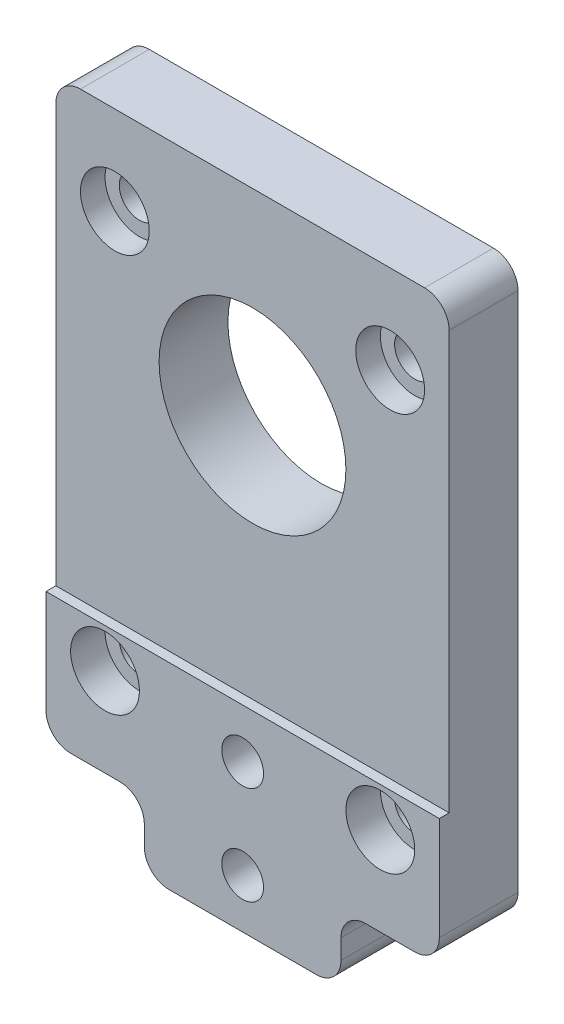
ISO-10303-21;
HEADER;
FILE_DESCRIPTION(('STEP AP214'),'2;1');
FILE_NAME('part.step','',(''),(''),'','','');
FILE_SCHEMA(('AUTOMOTIVE_DESIGN { 1 0 10303 214 1 1 1 1 }'));
ENDSEC;
DATA;
#1=APPLICATION_CONTEXT('core data for automotive mechanical design processes');
#2=APPLICATION_PROTOCOL_DEFINITION('international standard','automotive_design',2000,#1);
#3=PRODUCT_CONTEXT('',#1,'mechanical');
#4=PRODUCT('Part','Part','',(#3));
#5=PRODUCT_RELATED_PRODUCT_CATEGORY('part','',(#4));
#6=PRODUCT_DEFINITION_FORMATION('','',#4);
#7=PRODUCT_DEFINITION_CONTEXT('part definition',#1,'design');
#8=PRODUCT_DEFINITION('design','',#6,#7);
#9=PRODUCT_DEFINITION_SHAPE('','',#8);
#10=(LENGTH_UNIT() NAMED_UNIT(*) SI_UNIT(.MILLI.,.METRE.));
#11=(NAMED_UNIT(*) PLANE_ANGLE_UNIT() SI_UNIT($,.RADIAN.));
#12=(NAMED_UNIT(*) SI_UNIT($,.STERADIAN.) SOLID_ANGLE_UNIT());
#13=UNCERTAINTY_MEASURE_WITH_UNIT(LENGTH_MEASURE(1.E-05),#10,'distance_accuracy_value','');
#14=(GEOMETRIC_REPRESENTATION_CONTEXT(3) GLOBAL_UNCERTAINTY_ASSIGNED_CONTEXT((#13)) GLOBAL_UNIT_ASSIGNED_CONTEXT((#10,
#11,#12)) REPRESENTATION_CONTEXT('',''));
#15=CARTESIAN_POINT('',(0.,0.,0.));
#16=DIRECTION('',(0.,0.,1.));
#17=DIRECTION('',(1.,0.,0.));
#18=AXIS2_PLACEMENT_3D('',#15,#16,#17);
#19=CARTESIAN_POINT('',(-14.,41.,0.));
#20=DIRECTION('',(0.,0.,1.));
#21=DIRECTION('',(1.,0.,0.));
#22=AXIS2_PLACEMENT_3D('',#19,#20,#21);
#23=CYLINDRICAL_SURFACE('',#22,2.05);
#24=CARTESIAN_POINT('',(-14.,41.,0.));
#25=DIRECTION('',(0.,0.,1.));
#26=DIRECTION('',(1.,0.,0.));
#27=AXIS2_PLACEMENT_3D('',#24,#25,#26);
#28=CIRCLE('',#27,2.05);
#29=CARTESIAN_POINT('',(-11.95,41.,0.));
#30=VERTEX_POINT('',#29);
#31=EDGE_CURVE('E341',#30,#30,#28,.T.);
#32=ORIENTED_EDGE('',*,*,#31,.F.);
#33=EDGE_LOOP('',(#32));
#34=FACE_BOUND('',#33,.T.);
#35=CARTESIAN_POINT('',(-14.,41.,4.5));
#36=DIRECTION('',(0.,0.,1.));
#37=DIRECTION('',(1.,0.,0.));
#38=AXIS2_PLACEMENT_3D('',#35,#36,#37);
#39=CIRCLE('',#38,2.05);
#40=CARTESIAN_POINT('',(-11.95,41.,4.5));
#41=VERTEX_POINT('',#40);
#42=EDGE_CURVE('E37',#41,#41,#39,.F.);
#43=ORIENTED_EDGE('',*,*,#42,.F.);
#44=EDGE_LOOP('',(#43));
#45=FACE_BOUND('',#44,.T.);
#46=ADVANCED_FACE('F33',(#34,#45),#23,.F.);
#47=CARTESIAN_POINT('',(14.,40.9999999999999,0.));
#48=DIRECTION('',(0.,0.,1.));
#49=DIRECTION('',(1.,0.,0.));
#50=AXIS2_PLACEMENT_3D('',#47,#48,#49);
#51=CYLINDRICAL_SURFACE('',#50,2.05);
#52=CARTESIAN_POINT('',(14.,40.9999999999999,0.));
#53=DIRECTION('',(0.,0.,1.));
#54=DIRECTION('',(1.,0.,0.));
#55=AXIS2_PLACEMENT_3D('',#52,#53,#54);
#56=CIRCLE('',#55,2.05);
#57=CARTESIAN_POINT('',(16.05,40.9999999999999,0.));
#58=VERTEX_POINT('',#57);
#59=EDGE_CURVE('E338',#58,#58,#56,.T.);
#60=ORIENTED_EDGE('',*,*,#59,.F.);
#61=EDGE_LOOP('',(#60));
#62=FACE_BOUND('',#61,.T.);
#63=CARTESIAN_POINT('',(14.,40.9999999999999,4.5));
#64=DIRECTION('',(0.,0.,1.));
#65=DIRECTION('',(1.,0.,0.));
#66=AXIS2_PLACEMENT_3D('',#63,#64,#65);
#67=CIRCLE('',#66,2.05);
#68=CARTESIAN_POINT('',(16.05,40.9999999999999,4.5));
#69=VERTEX_POINT('',#68);
#70=EDGE_CURVE('E292',#69,#69,#67,.F.);
#71=ORIENTED_EDGE('',*,*,#70,.F.);
#72=EDGE_LOOP('',(#71));
#73=FACE_BOUND('',#72,.T.);
#74=ADVANCED_FACE('F437',(#62,#73),#51,.F.);
#75=CARTESIAN_POINT('',(14.,1.,0.));
#76=DIRECTION('',(0.,0.,1.));
#77=DIRECTION('',(1.,0.,0.));
#78=AXIS2_PLACEMENT_3D('',#75,#76,#77);
#79=CYLINDRICAL_SURFACE('',#78,2.05);
#80=CARTESIAN_POINT('',(14.,1.,0.));
#81=DIRECTION('',(0.,0.,1.));
#82=DIRECTION('',(1.,0.,0.));
#83=AXIS2_PLACEMENT_3D('',#80,#81,#82);
#84=CIRCLE('',#83,2.05);
#85=CARTESIAN_POINT('',(16.05,1.,0.));
#86=VERTEX_POINT('',#85);
#87=EDGE_CURVE('E335',#86,#86,#84,.T.);
#88=ORIENTED_EDGE('',*,*,#87,.F.);
#89=EDGE_LOOP('',(#88));
#90=FACE_BOUND('',#89,.T.);
#91=CARTESIAN_POINT('',(14.,1.,4.5));
#92=DIRECTION('',(0.,0.,1.));
#93=DIRECTION('',(1.,0.,0.));
#94=AXIS2_PLACEMENT_3D('',#91,#92,#93);
#95=CIRCLE('',#94,2.05);
#96=CARTESIAN_POINT('',(16.05,1.,4.5));
#97=VERTEX_POINT('',#96);
#98=EDGE_CURVE('E284',#97,#97,#95,.F.);
#99=ORIENTED_EDGE('',*,*,#98,.F.);
#100=EDGE_LOOP('',(#99));
#101=FACE_BOUND('',#100,.T.);
#102=ADVANCED_FACE('F443',(#90,#101),#79,.F.);
#103=CARTESIAN_POINT('',(-14.,1.,0.));
#104=DIRECTION('',(0.,0.,1.));
#105=DIRECTION('',(1.,0.,0.));
#106=AXIS2_PLACEMENT_3D('',#103,#104,#105);
#107=CYLINDRICAL_SURFACE('',#106,2.05);
#108=CARTESIAN_POINT('',(-14.,1.,0.));
#109=DIRECTION('',(0.,0.,1.));
#110=DIRECTION('',(1.,0.,0.));
#111=AXIS2_PLACEMENT_3D('',#108,#109,#110);
#112=CIRCLE('',#111,2.05);
#113=CARTESIAN_POINT('',(-11.95,1.,0.));
#114=VERTEX_POINT('',#113);
#115=EDGE_CURVE('E169',#114,#114,#112,.T.);
#116=ORIENTED_EDGE('',*,*,#115,.F.);
#117=EDGE_LOOP('',(#116));
#118=FACE_BOUND('',#117,.T.);
#119=CARTESIAN_POINT('',(-14.,1.,4.5));
#120=DIRECTION('',(0.,0.,1.));
#121=DIRECTION('',(1.,0.,0.));
#122=AXIS2_PLACEMENT_3D('',#119,#120,#121);
#123=CIRCLE('',#122,2.05);
#124=CARTESIAN_POINT('',(-11.95,1.,4.5));
#125=VERTEX_POINT('',#124);
#126=EDGE_CURVE('E279',#125,#125,#123,.F.);
#127=ORIENTED_EDGE('',*,*,#126,.F.);
#128=EDGE_LOOP('',(#127));
#129=FACE_BOUND('',#128,.T.);
#130=ADVANCED_FACE('F469',(#118,#129),#107,.F.);
#131=CARTESIAN_POINT('',(0.,30.,8.));
#132=DIRECTION('',(0.,0.,1.));
#133=DIRECTION('',(1.,0.,0.));
#134=AXIS2_PLACEMENT_3D('',#131,#132,#133);
#135=PLANE('',#134);
#136=CARTESIAN_POINT('',(14.,1.,8.));
#137=DIRECTION('',(0.,0.,1.));
#138=DIRECTION('',(1.,0.,0.));
#139=AXIS2_PLACEMENT_3D('',#136,#137,#138);
#140=CIRCLE('',#139,3.5);
#141=CARTESIAN_POINT('',(17.5,1.,8.));
#142=VERTEX_POINT('',#141);
#143=EDGE_CURVE('E295',#142,#142,#140,.T.);
#144=ORIENTED_EDGE('',*,*,#143,.F.);
#145=EDGE_LOOP('',(#144));
#146=FACE_BOUND('',#145,.T.);
#147=CARTESIAN_POINT('',(-14.,1.,8.));
#148=DIRECTION('',(0.,0.,1.));
#149=DIRECTION('',(1.,0.,0.));
#150=AXIS2_PLACEMENT_3D('',#147,#148,#149);
#151=CIRCLE('',#150,3.5);
#152=CARTESIAN_POINT('',(-10.5,1.,8.));
#153=VERTEX_POINT('',#152);
#154=EDGE_CURVE('E287',#153,#153,#151,.T.);
#155=ORIENTED_EDGE('',*,*,#154,.F.);
#156=EDGE_LOOP('',(#155));
#157=FACE_BOUND('',#156,.T.);
#158=CARTESIAN_POINT('',(0.,0.,8.));
#159=DIRECTION('',(0.,0.,1.));
#160=DIRECTION('',(1.,0.,0.));
#161=AXIS2_PLACEMENT_3D('',#158,#159,#160);
#162=CIRCLE('',#161,2.125);
#163=CARTESIAN_POINT('',(2.125,0.,8.));
#164=VERTEX_POINT('',#163);
#165=EDGE_CURVE('E282',#164,#164,#162,.T.);
#166=ORIENTED_EDGE('',*,*,#165,.F.);
#167=EDGE_LOOP('',(#166));
#168=FACE_BOUND('',#167,.T.);
#169=CARTESIAN_POINT('',(0.,-10.,8.));
#170=DIRECTION('',(0.,0.,1.));
#171=DIRECTION('',(1.,0.,0.));
#172=AXIS2_PLACEMENT_3D('',#169,#170,#171);
#173=CIRCLE('',#172,2.125);
#174=CARTESIAN_POINT('',(2.125,-10.,8.));
#175=VERTEX_POINT('',#174);
#176=EDGE_CURVE('E190',#175,#175,#173,.T.);
#177=ORIENTED_EDGE('',*,*,#176,.F.);
#178=EDGE_LOOP('',(#177));
#179=FACE_BOUND('',#178,.T.);
#180=DIRECTION('',(1.,0.,0.));
#181=VECTOR('',#180,1.);
#182=CARTESIAN_POINT('',(-30.,5.,8.));
#183=LINE('',#182,#181);
#184=CARTESIAN_POINT('',(-20.,5.,8.));
#185=VERTEX_POINT('',#184);
#186=CARTESIAN_POINT('',(20.,5.,8.));
#187=VERTEX_POINT('',#186);
#188=EDGE_CURVE('E164',#185,#187,#183,.T.);
#189=ORIENTED_EDGE('',*,*,#188,.F.);
#190=DIRECTION('',(0.,1.,0.));
#191=VECTOR('',#190,1.);
#192=CARTESIAN_POINT('',(-20.,50.,8.00000000000001));
#193=LINE('',#192,#191);
#194=CARTESIAN_POINT('',(-20.,-5.5,8.00000000000001));
#195=VERTEX_POINT('',#194);
#196=EDGE_CURVE('E175',#195,#185,#193,.T.);
#197=ORIENTED_EDGE('',*,*,#196,.F.);
#198=CARTESIAN_POINT('',(-17.5,-5.5,8.00000000000001));
#199=DIRECTION('',(0.,0.,1.));
#200=DIRECTION('',(1.,0.,0.));
#201=AXIS2_PLACEMENT_3D('',#198,#199,#200);
#202=CIRCLE('',#201,2.5);
#203=CARTESIAN_POINT('',(-17.5,-8.,8.00000000000001));
#204=VERTEX_POINT('',#203);
#205=EDGE_CURVE('E254',#195,#204,#202,.T.);
#206=ORIENTED_EDGE('',*,*,#205,.T.);
#207=DIRECTION('',(-1.,0.,0.));
#208=VECTOR('',#207,1.);
#209=CARTESIAN_POINT('',(20.,-8.,8.00000000000001));
#210=LINE('',#209,#208);
#211=CARTESIAN_POINT('',(-12.5,-8.,8.00000000000001));
#212=VERTEX_POINT('',#211);
#213=EDGE_CURVE('E187',#212,#204,#210,.T.);
#214=ORIENTED_EDGE('',*,*,#213,.F.);
#215=CARTESIAN_POINT('',(-12.5,-10.5,8.));
#216=DIRECTION('',(0.,0.,1.));
#217=DIRECTION('',(1.,0.,0.));
#218=AXIS2_PLACEMENT_3D('',#215,#216,#217);
#219=CIRCLE('',#218,2.5);
#220=CARTESIAN_POINT('',(-10.,-10.5,8.));
#221=VERTEX_POINT('',#220);
#222=EDGE_CURVE('E42',#212,#221,#219,.F.);
#223=ORIENTED_EDGE('',*,*,#222,.T.);
#224=DIRECTION('',(0.,-1.,0.));
#225=VECTOR('',#224,1.);
#226=CARTESIAN_POINT('',(-10.,-15.,8.));
#227=LINE('',#226,#225);
#228=CARTESIAN_POINT('',(-10.,-12.5,8.));
#229=VERTEX_POINT('',#228);
#230=EDGE_CURVE('E196',#221,#229,#227,.T.);
#231=ORIENTED_EDGE('',*,*,#230,.T.);
#232=CARTESIAN_POINT('',(-7.5,-12.5,8.));
#233=DIRECTION('',(0.,0.,1.));
#234=DIRECTION('',(1.,0.,0.));
#235=AXIS2_PLACEMENT_3D('',#232,#233,#234);
#236=CIRCLE('',#235,2.5);
#237=CARTESIAN_POINT('',(-7.5,-15.,8.));
#238=VERTEX_POINT('',#237);
#239=EDGE_CURVE('E256',#229,#238,#236,.T.);
#240=ORIENTED_EDGE('',*,*,#239,.T.);
#241=DIRECTION('',(1.,0.,0.));
#242=VECTOR('',#241,1.);
#243=CARTESIAN_POINT('',(10.,-15.,8.));
#244=LINE('',#243,#242);
#245=CARTESIAN_POINT('',(7.5,-15.,8.));
#246=VERTEX_POINT('',#245);
#247=EDGE_CURVE('E199',#238,#246,#244,.T.);
#248=ORIENTED_EDGE('',*,*,#247,.T.);
#249=CARTESIAN_POINT('',(7.5,-12.5,8.));
#250=DIRECTION('',(0.,0.,1.));
#251=DIRECTION('',(1.,0.,0.));
#252=AXIS2_PLACEMENT_3D('',#249,#250,#251);
#253=CIRCLE('',#252,2.5);
#254=CARTESIAN_POINT('',(10.,-12.5,8.));
#255=VERTEX_POINT('',#254);
#256=EDGE_CURVE('E250',#246,#255,#253,.T.);
#257=ORIENTED_EDGE('',*,*,#256,.T.);
#258=DIRECTION('',(0.,1.,0.));
#259=VECTOR('',#258,1.);
#260=CARTESIAN_POINT('',(10.,-15.,8.));
#261=LINE('',#260,#259);
#262=CARTESIAN_POINT('',(10.,-10.5,8.));
#263=VERTEX_POINT('',#262);
#264=EDGE_CURVE('E203',#255,#263,#261,.T.);
#265=ORIENTED_EDGE('',*,*,#264,.T.);
#266=CARTESIAN_POINT('',(12.5,-10.5,8.));
#267=DIRECTION('',(0.,0.,1.));
#268=DIRECTION('',(1.,0.,0.));
#269=AXIS2_PLACEMENT_3D('',#266,#267,#268);
#270=CIRCLE('',#269,2.5);
#271=CARTESIAN_POINT('',(12.5,-8.,8.00000000000001));
#272=VERTEX_POINT('',#271);
#273=EDGE_CURVE('E272',#263,#272,#270,.F.);
#274=ORIENTED_EDGE('',*,*,#273,.T.);
#275=CARTESIAN_POINT('',(17.5,-8.,8.00000000000001));
#276=VERTEX_POINT('',#275);
#277=EDGE_CURVE('E182',#276,#272,#210,.T.);
#278=ORIENTED_EDGE('',*,*,#277,.F.);
#279=CARTESIAN_POINT('',(17.5,-5.50000000000001,8.00000000000001));
#280=DIRECTION('',(0.,0.,1.));
#281=DIRECTION('',(1.,0.,0.));
#282=AXIS2_PLACEMENT_3D('',#279,#280,#281);
#283=CIRCLE('',#282,2.5);
#284=CARTESIAN_POINT('',(20.,-5.50000000000001,8.00000000000001));
#285=VERTEX_POINT('',#284);
#286=EDGE_CURVE('E252',#276,#285,#283,.T.);
#287=ORIENTED_EDGE('',*,*,#286,.T.);
#288=DIRECTION('',(0.,-1.,0.));
#289=VECTOR('',#288,1.);
#290=CARTESIAN_POINT('',(20.,50.,8.00000000000001));
#291=LINE('',#290,#289);
#292=EDGE_CURVE('E178',#187,#285,#291,.T.);
#293=ORIENTED_EDGE('',*,*,#292,.F.);
#294=EDGE_LOOP('',(#189,#197,#206,#214,#223,#231,#240,#248,#257,#265,#274,#278,#287,#293));
#295=FACE_BOUND('',#294,.T.);
#296=ADVANCED_FACE('F174',(#146,#157,#168,#179,#295),#135,.T.);
#297=CARTESIAN_POINT('',(0.,30.,0.));
#298=DIRECTION('',(0.,0.,1.));
#299=DIRECTION('',(1.,0.,0.));
#300=AXIS2_PLACEMENT_3D('',#297,#298,#299);
#301=PLANE('',#300);
#302=CARTESIAN_POINT('',(0.,0.,0.));
#303=DIRECTION('',(0.,0.,1.));
#304=DIRECTION('',(1.,0.,0.));
#305=AXIS2_PLACEMENT_3D('',#302,#303,#304);
#306=CIRCLE('',#305,2.125);
#307=CARTESIAN_POINT('',(2.125,0.,0.));
#308=VERTEX_POINT('',#307);
#309=EDGE_CURVE('E179',#308,#308,#306,.T.);
#310=ORIENTED_EDGE('',*,*,#309,.T.);
#311=EDGE_LOOP('',(#310));
#312=FACE_BOUND('',#311,.T.);
#313=ORIENTED_EDGE('',*,*,#115,.T.);
#314=EDGE_LOOP('',(#313));
#315=FACE_BOUND('',#314,.T.);
#316=ORIENTED_EDGE('',*,*,#87,.T.);
#317=EDGE_LOOP('',(#316));
#318=FACE_BOUND('',#317,.T.);
#319=ORIENTED_EDGE('',*,*,#59,.T.);
#320=EDGE_LOOP('',(#319));
#321=FACE_BOUND('',#320,.T.);
#322=ORIENTED_EDGE('',*,*,#31,.T.);
#323=EDGE_LOOP('',(#322));
#324=FACE_BOUND('',#323,.T.);
#325=CARTESIAN_POINT('',(0.,30.,0.));
#326=DIRECTION('',(0.,0.,1.));
#327=DIRECTION('',(1.,0.,0.));
#328=AXIS2_PLACEMENT_3D('',#325,#326,#327);
#329=CIRCLE('',#328,9.5);
#330=CARTESIAN_POINT('',(9.5,30.,0.));
#331=VERTEX_POINT('',#330);
#332=EDGE_CURVE('E344',#331,#331,#329,.T.);
#333=ORIENTED_EDGE('',*,*,#332,.T.);
#334=EDGE_LOOP('',(#333));
#335=FACE_BOUND('',#334,.T.);
#336=CARTESIAN_POINT('',(0.,-10.,0.));
#337=DIRECTION('',(0.,0.,1.));
#338=DIRECTION('',(1.,0.,0.));
#339=AXIS2_PLACEMENT_3D('',#336,#337,#338);
#340=CIRCLE('',#339,2.125);
#341=CARTESIAN_POINT('',(2.125,-10.,0.));
#342=VERTEX_POINT('',#341);
#343=EDGE_CURVE('E184',#342,#342,#340,.T.);
#344=ORIENTED_EDGE('',*,*,#343,.T.);
#345=EDGE_LOOP('',(#344));
#346=FACE_BOUND('',#345,.T.);
#347=DIRECTION('',(1.,0.,0.));
#348=VECTOR('',#347,1.);
#349=CARTESIAN_POINT('',(10.,-15.,0.));
#350=LINE('',#349,#348);
#351=CARTESIAN_POINT('',(-7.5,-15.,0.));
#352=VERTEX_POINT('',#351);
#353=CARTESIAN_POINT('',(7.5,-15.,0.));
#354=VERTEX_POINT('',#353);
#355=EDGE_CURVE('E209',#352,#354,#350,.T.);
#356=ORIENTED_EDGE('',*,*,#355,.F.);
#357=CARTESIAN_POINT('',(-7.5,-12.5,0.));
#358=DIRECTION('',(0.,0.,1.));
#359=DIRECTION('',(1.,0.,0.));
#360=AXIS2_PLACEMENT_3D('',#357,#358,#359);
#361=CIRCLE('',#360,2.5);
#362=CARTESIAN_POINT('',(-10.,-12.5,0.));
#363=VERTEX_POINT('',#362);
#364=EDGE_CURVE('E248',#352,#363,#361,.F.);
#365=ORIENTED_EDGE('',*,*,#364,.T.);
#366=DIRECTION('',(0.,-1.,0.));
#367=VECTOR('',#366,1.);
#368=CARTESIAN_POINT('',(-10.,-15.,0.));
#369=LINE('',#368,#367);
#370=CARTESIAN_POINT('',(-10.,-10.5,0.));
#371=VERTEX_POINT('',#370);
#372=EDGE_CURVE('E193',#371,#363,#369,.T.);
#373=ORIENTED_EDGE('',*,*,#372,.F.);
#374=CARTESIAN_POINT('',(-12.5,-10.5,0.));
#375=DIRECTION('',(0.,0.,1.));
#376=DIRECTION('',(1.,0.,0.));
#377=AXIS2_PLACEMENT_3D('',#374,#375,#376);
#378=CIRCLE('',#377,2.5);
#379=CARTESIAN_POINT('',(-12.5,-8.,0.));
#380=VERTEX_POINT('',#379);
#381=EDGE_CURVE('E276',#371,#380,#378,.T.);
#382=ORIENTED_EDGE('',*,*,#381,.T.);
#383=DIRECTION('',(-1.,0.,0.));
#384=VECTOR('',#383,1.);
#385=CARTESIAN_POINT('',(20.,-8.,0.));
#386=LINE('',#385,#384);
#387=CARTESIAN_POINT('',(-17.5,-8.,0.));
#388=VERTEX_POINT('',#387);
#389=EDGE_CURVE('E355',#380,#388,#386,.T.);
#390=ORIENTED_EDGE('',*,*,#389,.T.);
#391=CARTESIAN_POINT('',(-17.5,-5.5,0.));
#392=DIRECTION('',(0.,0.,1.));
#393=DIRECTION('',(1.,0.,0.));
#394=AXIS2_PLACEMENT_3D('',#391,#392,#393);
#395=CIRCLE('',#394,2.5);
#396=CARTESIAN_POINT('',(-20.,-5.49999999999998,0.));
#397=VERTEX_POINT('',#396);
#398=EDGE_CURVE('E242',#388,#397,#395,.F.);
#399=ORIENTED_EDGE('',*,*,#398,.T.);
#400=DIRECTION('',(0.,1.,0.));
#401=VECTOR('',#400,1.);
#402=CARTESIAN_POINT('',(-20.,50.,0.));
#403=LINE('',#402,#401);
#404=CARTESIAN_POINT('',(-20.,47.5,0.));
#405=VERTEX_POINT('',#404);
#406=EDGE_CURVE('E351',#397,#405,#403,.T.);
#407=ORIENTED_EDGE('',*,*,#406,.T.);
#408=CARTESIAN_POINT('',(-17.5,47.5,0.));
#409=DIRECTION('',(0.,0.,1.));
#410=DIRECTION('',(1.,0.,0.));
#411=AXIS2_PLACEMENT_3D('',#408,#409,#410);
#412=CIRCLE('',#411,2.5);
#413=CARTESIAN_POINT('',(-17.5,50.,0.));
#414=VERTEX_POINT('',#413);
#415=EDGE_CURVE('E244',#405,#414,#412,.F.);
#416=ORIENTED_EDGE('',*,*,#415,.T.);
#417=DIRECTION('',(1.,0.,0.));
#418=VECTOR('',#417,1.);
#419=CARTESIAN_POINT('',(20.,50.,0.));
#420=LINE('',#419,#418);
#421=CARTESIAN_POINT('',(17.5,50.,0.));
#422=VERTEX_POINT('',#421);
#423=EDGE_CURVE('E348',#414,#422,#420,.T.);
#424=ORIENTED_EDGE('',*,*,#423,.T.);
#425=CARTESIAN_POINT('',(17.5,47.5,0.));
#426=DIRECTION('',(0.,0.,1.));
#427=DIRECTION('',(1.,0.,0.));
#428=AXIS2_PLACEMENT_3D('',#425,#426,#427);
#429=CIRCLE('',#428,2.5);
#430=CARTESIAN_POINT('',(20.,47.5,0.));
#431=VERTEX_POINT('',#430);
#432=EDGE_CURVE('E246',#422,#431,#429,.F.);
#433=ORIENTED_EDGE('',*,*,#432,.T.);
#434=DIRECTION('',(0.,-1.,0.));
#435=VECTOR('',#434,1.);
#436=CARTESIAN_POINT('',(20.,50.,0.));
#437=LINE('',#436,#435);
#438=CARTESIAN_POINT('',(20.,-5.49999999999999,0.));
#439=VERTEX_POINT('',#438);
#440=EDGE_CURVE('E347',#431,#439,#437,.T.);
#441=ORIENTED_EDGE('',*,*,#440,.T.);
#442=CARTESIAN_POINT('',(17.5,-5.50000000000001,0.));
#443=DIRECTION('',(0.,0.,1.));
#444=DIRECTION('',(1.,0.,0.));
#445=AXIS2_PLACEMENT_3D('',#442,#443,#444);
#446=CIRCLE('',#445,2.5);
#447=CARTESIAN_POINT('',(17.5,-8.,0.));
#448=VERTEX_POINT('',#447);
#449=EDGE_CURVE('E240',#439,#448,#446,.F.);
#450=ORIENTED_EDGE('',*,*,#449,.T.);
#451=CARTESIAN_POINT('',(12.5,-8.,0.));
#452=VERTEX_POINT('',#451);
#453=EDGE_CURVE('E354',#448,#452,#386,.T.);
#454=ORIENTED_EDGE('',*,*,#453,.T.);
#455=CARTESIAN_POINT('',(12.5,-10.5,0.));
#456=DIRECTION('',(0.,0.,1.));
#457=DIRECTION('',(1.,0.,0.));
#458=AXIS2_PLACEMENT_3D('',#455,#456,#457);
#459=CIRCLE('',#458,2.5);
#460=CARTESIAN_POINT('',(10.,-10.5,0.));
#461=VERTEX_POINT('',#460);
#462=EDGE_CURVE('E274',#452,#461,#459,.T.);
#463=ORIENTED_EDGE('',*,*,#462,.T.);
#464=DIRECTION('',(0.,1.,0.));
#465=VECTOR('',#464,1.);
#466=CARTESIAN_POINT('',(10.,-15.,0.));
#467=LINE('',#466,#465);
#468=CARTESIAN_POINT('',(10.,-12.5,0.));
#469=VERTEX_POINT('',#468);
#470=EDGE_CURVE('E200',#469,#461,#467,.T.);
#471=ORIENTED_EDGE('',*,*,#470,.F.);
#472=CARTESIAN_POINT('',(7.5,-12.5,0.));
#473=DIRECTION('',(0.,0.,1.));
#474=DIRECTION('',(1.,0.,0.));
#475=AXIS2_PLACEMENT_3D('',#472,#473,#474);
#476=CIRCLE('',#475,2.5);
#477=EDGE_CURVE('E238',#469,#354,#476,.F.);
#478=ORIENTED_EDGE('',*,*,#477,.T.);
#479=EDGE_LOOP('',(#356,#365,#373,#382,#390,#399,#407,#416,#424,#433,#441,#450,#454,#463,#471,#478));
#480=FACE_BOUND('',#479,.T.);
#481=ADVANCED_FACE('F371',(#312,#315,#318,#321,#324,#335,#346,#480),#301,.F.);
#482=CARTESIAN_POINT('',(-10.,-15.,8.));
#483=DIRECTION('',(1.,0.,0.));
#484=DIRECTION('',(0.,0.,-1.));
#485=AXIS2_PLACEMENT_3D('',#482,#483,#484);
#486=PLANE('',#485);
#487=ORIENTED_EDGE('',*,*,#230,.F.);
#488=DIRECTION('',(0.,0.,-1.));
#489=VECTOR('',#488,1.);
#490=CARTESIAN_POINT('',(-10.,-10.5,8.));
#491=LINE('',#490,#489);
#492=EDGE_CURVE('E225',#221,#371,#491,.T.);
#493=ORIENTED_EDGE('',*,*,#492,.T.);
#494=ORIENTED_EDGE('',*,*,#372,.T.);
#495=DIRECTION('',(0.,0.,-1.));
#496=VECTOR('',#495,1.);
#497=CARTESIAN_POINT('',(-10.,-12.5,8.));
#498=LINE('',#497,#496);
#499=EDGE_CURVE('E223',#363,#229,#498,.F.);
#500=ORIENTED_EDGE('',*,*,#499,.T.);
#501=EDGE_LOOP('',(#487,#493,#494,#500));
#502=FACE_BOUND('',#501,.T.);
#503=ADVANCED_FACE('F424',(#502),#486,.F.);
#504=CARTESIAN_POINT('',(10.,-15.,8.));
#505=DIRECTION('',(0.,1.,0.));
#506=DIRECTION('',(-1.,0.,0.));
#507=AXIS2_PLACEMENT_3D('',#504,#505,#506);
#508=PLANE('',#507);
#509=ORIENTED_EDGE('',*,*,#247,.F.);
#510=DIRECTION('',(0.,0.,-1.));
#511=VECTOR('',#510,1.);
#512=CARTESIAN_POINT('',(-7.5,-15.,8.));
#513=LINE('',#512,#511);
#514=EDGE_CURVE('E235',#238,#352,#513,.T.);
#515=ORIENTED_EDGE('',*,*,#514,.T.);
#516=ORIENTED_EDGE('',*,*,#355,.T.);
#517=DIRECTION('',(0.,0.,-1.));
#518=VECTOR('',#517,1.);
#519=CARTESIAN_POINT('',(7.5,-15.,8.));
#520=LINE('',#519,#518);
#521=EDGE_CURVE('E233',#354,#246,#520,.F.);
#522=ORIENTED_EDGE('',*,*,#521,.T.);
#523=EDGE_LOOP('',(#509,#515,#516,#522));
#524=FACE_BOUND('',#523,.T.);
#525=ADVANCED_FACE('F415',(#524),#508,.F.);
#526=CARTESIAN_POINT('',(10.,-15.,8.));
#527=DIRECTION('',(-1.,0.,0.));
#528=DIRECTION('',(0.,0.,1.));
#529=AXIS2_PLACEMENT_3D('',#526,#527,#528);
#530=PLANE('',#529);
#531=ORIENTED_EDGE('',*,*,#470,.T.);
#532=DIRECTION('',(0.,0.,1.));
#533=VECTOR('',#532,1.);
#534=CARTESIAN_POINT('',(10.,-10.5,8.));
#535=LINE('',#534,#533);
#536=EDGE_CURVE('E216',#461,#263,#535,.T.);
#537=ORIENTED_EDGE('',*,*,#536,.T.);
#538=ORIENTED_EDGE('',*,*,#264,.F.);
#539=DIRECTION('',(0.,0.,-1.));
#540=VECTOR('',#539,1.);
#541=CARTESIAN_POINT('',(10.,-12.5,8.));
#542=LINE('',#541,#540);
#543=EDGE_CURVE('E206',#255,#469,#542,.T.);
#544=ORIENTED_EDGE('',*,*,#543,.T.);
#545=EDGE_LOOP('',(#531,#537,#538,#544));
#546=FACE_BOUND('',#545,.T.);
#547=ADVANCED_FACE('F407',(#546),#530,.F.);
#548=CARTESIAN_POINT('',(0.,-10.,8.));
#549=DIRECTION('',(0.,0.,-1.));
#550=DIRECTION('',(-1.,0.,0.));
#551=AXIS2_PLACEMENT_3D('',#548,#549,#550);
#552=CYLINDRICAL_SURFACE('',#551,2.125);
#553=ORIENTED_EDGE('',*,*,#176,.T.);
#554=EDGE_LOOP('',(#553));
#555=FACE_BOUND('',#554,.T.);
#556=ORIENTED_EDGE('',*,*,#343,.F.);
#557=EDGE_LOOP('',(#556));
#558=FACE_BOUND('',#557,.T.);
#559=ADVANCED_FACE('F463',(#555,#558),#552,.F.);
#560=CARTESIAN_POINT('',(20.,-8.,78.4556598152342));
#561=DIRECTION('',(0.,-1.,0.));
#562=DIRECTION('',(1.,0.,0.));
#563=AXIS2_PLACEMENT_3D('',#560,#561,#562);
#564=PLANE('',#563);
#565=ORIENTED_EDGE('',*,*,#389,.F.);
#566=DIRECTION('',(0.,0.,-1.));
#567=VECTOR('',#566,1.);
#568=CARTESIAN_POINT('',(-12.5,-8.,78.4556598152342));
#569=LINE('',#568,#567);
#570=EDGE_CURVE('E231',#380,#212,#569,.F.);
#571=ORIENTED_EDGE('',*,*,#570,.T.);
#572=ORIENTED_EDGE('',*,*,#213,.T.);
#573=DIRECTION('',(0.,0.,-1.));
#574=VECTOR('',#573,1.);
#575=CARTESIAN_POINT('',(-17.5,-8.,78.4556598152342));
#576=LINE('',#575,#574);
#577=EDGE_CURVE('E228',#204,#388,#576,.T.);
#578=ORIENTED_EDGE('',*,*,#577,.T.);
#579=EDGE_LOOP('',(#565,#571,#572,#578));
#580=FACE_BOUND('',#579,.T.);
#581=ADVANCED_FACE('F364',(#580),#564,.T.);
#582=ORIENTED_EDGE('',*,*,#277,.T.);
#583=DIRECTION('',(0.,0.,1.));
#584=VECTOR('',#583,1.);
#585=CARTESIAN_POINT('',(12.5,-8.,78.4556598152342));
#586=LINE('',#585,#584);
#587=EDGE_CURVE('E221',#272,#452,#586,.F.);
#588=ORIENTED_EDGE('',*,*,#587,.T.);
#589=ORIENTED_EDGE('',*,*,#453,.F.);
#590=DIRECTION('',(0.,0.,-1.));
#591=VECTOR('',#590,1.);
#592=CARTESIAN_POINT('',(17.5,-8.,78.4556598152342));
#593=LINE('',#592,#591);
#594=EDGE_CURVE('E219',#448,#276,#593,.F.);
#595=ORIENTED_EDGE('',*,*,#594,.T.);
#596=EDGE_LOOP('',(#582,#588,#589,#595));
#597=FACE_BOUND('',#596,.T.);
#598=ADVANCED_FACE('F399',(#597),#564,.T.);
#599=CARTESIAN_POINT('',(-20.,50.,78.4556598152342));
#600=DIRECTION('',(-1.,0.,0.));
#601=DIRECTION('',(0.,-1.,0.));
#602=AXIS2_PLACEMENT_3D('',#599,#600,#601);
#603=PLANE('',#602);
#604=DIRECTION('',(0.,0.,1.));
#605=VECTOR('',#604,1.);
#606=CARTESIAN_POINT('',(-20.,5.,78.4556598152342));
#607=LINE('',#606,#605);
#608=CARTESIAN_POINT('',(-20.,5.,7.));
#609=VERTEX_POINT('',#608);
#610=EDGE_CURVE('E161',#609,#185,#607,.T.);
#611=ORIENTED_EDGE('',*,*,#610,.F.);
#612=DIRECTION('',(0.,-1.,0.));
#613=VECTOR('',#612,1.);
#614=CARTESIAN_POINT('',(-20.,50.,7.00000000000001));
#615=LINE('',#614,#613);
#616=CARTESIAN_POINT('',(-20.,47.5,7.00000000000001));
#617=VERTEX_POINT('',#616);
#618=EDGE_CURVE('E328',#617,#609,#615,.T.);
#619=ORIENTED_EDGE('',*,*,#618,.F.);
#620=DIRECTION('',(0.,0.,-1.));
#621=VECTOR('',#620,1.);
#622=CARTESIAN_POINT('',(-20.,47.5,78.4556598152342));
#623=LINE('',#622,#621);
#624=EDGE_CURVE('E270',#617,#405,#623,.T.);
#625=ORIENTED_EDGE('',*,*,#624,.T.);
#626=ORIENTED_EDGE('',*,*,#406,.F.);
#627=DIRECTION('',(0.,0.,-1.));
#628=VECTOR('',#627,1.);
#629=CARTESIAN_POINT('',(-20.,-5.5,78.4556598152342));
#630=LINE('',#629,#628);
#631=EDGE_CURVE('E58',#397,#195,#630,.F.);
#632=ORIENTED_EDGE('',*,*,#631,.T.);
#633=ORIENTED_EDGE('',*,*,#196,.T.);
#634=EDGE_LOOP('',(#611,#619,#625,#626,#632,#633));
#635=FACE_BOUND('',#634,.T.);
#636=ADVANCED_FACE('F181',(#635),#603,.T.);
#637=CARTESIAN_POINT('',(20.,50.,78.4556598152342));
#638=DIRECTION('',(0.,1.,0.));
#639=DIRECTION('',(0.,0.,1.));
#640=AXIS2_PLACEMENT_3D('',#637,#638,#639);
#641=PLANE('',#640);
#642=DIRECTION('',(-1.,0.,0.));
#643=VECTOR('',#642,1.);
#644=CARTESIAN_POINT('',(20.,50.,7.00000000000001));
#645=LINE('',#644,#643);
#646=CARTESIAN_POINT('',(17.5,50.,7.00000000000001));
#647=VERTEX_POINT('',#646);
#648=CARTESIAN_POINT('',(-17.5,50.,7.00000000000001));
#649=VERTEX_POINT('',#648);
#650=EDGE_CURVE('E50',#647,#649,#645,.T.);
#651=ORIENTED_EDGE('',*,*,#650,.F.);
#652=DIRECTION('',(0.,0.,-1.));
#653=VECTOR('',#652,1.);
#654=CARTESIAN_POINT('',(17.5,50.,78.4556598152342));
#655=LINE('',#654,#653);
#656=EDGE_CURVE('E261',#647,#422,#655,.T.);
#657=ORIENTED_EDGE('',*,*,#656,.T.);
#658=ORIENTED_EDGE('',*,*,#423,.F.);
#659=DIRECTION('',(0.,0.,-1.));
#660=VECTOR('',#659,1.);
#661=CARTESIAN_POINT('',(-17.5,50.,78.4556598152342));
#662=LINE('',#661,#660);
#663=EDGE_CURVE('E258',#414,#649,#662,.F.);
#664=ORIENTED_EDGE('',*,*,#663,.T.);
#665=EDGE_LOOP('',(#651,#657,#658,#664));
#666=FACE_BOUND('',#665,.T.);
#667=ADVANCED_FACE('F379',(#666),#641,.T.);
#668=CARTESIAN_POINT('',(20.,50.,78.4556598152342));
#669=DIRECTION('',(1.,0.,0.));
#670=DIRECTION('',(0.,1.,0.));
#671=AXIS2_PLACEMENT_3D('',#668,#669,#670);
#672=PLANE('',#671);
#673=DIRECTION('',(0.,0.,-1.));
#674=VECTOR('',#673,1.);
#675=CARTESIAN_POINT('',(20.,5.,78.4556598152342));
#676=LINE('',#675,#674);
#677=CARTESIAN_POINT('',(20.,5.,7.));
#678=VERTEX_POINT('',#677);
#679=EDGE_CURVE('E11',#187,#678,#676,.T.);
#680=ORIENTED_EDGE('',*,*,#679,.F.);
#681=ORIENTED_EDGE('',*,*,#292,.T.);
#682=DIRECTION('',(0.,0.,-1.));
#683=VECTOR('',#682,1.);
#684=CARTESIAN_POINT('',(20.,-5.50000000000001,78.4556598152342));
#685=LINE('',#684,#683);
#686=EDGE_CURVE('E263',#285,#439,#685,.T.);
#687=ORIENTED_EDGE('',*,*,#686,.T.);
#688=ORIENTED_EDGE('',*,*,#440,.F.);
#689=DIRECTION('',(0.,0.,-1.));
#690=VECTOR('',#689,1.);
#691=CARTESIAN_POINT('',(20.,47.5,78.4556598152342));
#692=LINE('',#691,#690);
#693=CARTESIAN_POINT('',(20.,47.5,7.00000000000001));
#694=VERTEX_POINT('',#693);
#695=EDGE_CURVE('E266',#431,#694,#692,.F.);
#696=ORIENTED_EDGE('',*,*,#695,.T.);
#697=DIRECTION('',(0.,1.,0.));
#698=VECTOR('',#697,1.);
#699=CARTESIAN_POINT('',(20.,50.,7.00000000000001));
#700=LINE('',#699,#698);
#701=EDGE_CURVE('E170',#678,#694,#700,.T.);
#702=ORIENTED_EDGE('',*,*,#701,.F.);
#703=EDGE_LOOP('',(#680,#681,#687,#688,#696,#702));
#704=FACE_BOUND('',#703,.T.);
#705=ADVANCED_FACE('F388',(#704),#672,.T.);
#706=CARTESIAN_POINT('',(12.5,-10.5,8.));
#707=DIRECTION('',(0.,0.,1.));
#708=DIRECTION('',(1.,0.,0.));
#709=AXIS2_PLACEMENT_3D('',#706,#707,#708);
#710=CYLINDRICAL_SURFACE('',#709,2.5);
#711=ORIENTED_EDGE('',*,*,#462,.F.);
#712=ORIENTED_EDGE('',*,*,#587,.F.);
#713=ORIENTED_EDGE('',*,*,#273,.F.);
#714=ORIENTED_EDGE('',*,*,#536,.F.);
#715=EDGE_LOOP('',(#711,#712,#713,#714));
#716=FACE_BOUND('',#715,.T.);
#717=ADVANCED_FACE('F403',(#716),#710,.F.);
#718=CARTESIAN_POINT('',(-12.5,-10.5,8.));
#719=DIRECTION('',(0.,0.,-1.));
#720=DIRECTION('',(-1.,0.,0.));
#721=AXIS2_PLACEMENT_3D('',#718,#719,#720);
#722=CYLINDRICAL_SURFACE('',#721,2.5);
#723=ORIENTED_EDGE('',*,*,#222,.F.);
#724=ORIENTED_EDGE('',*,*,#570,.F.);
#725=ORIENTED_EDGE('',*,*,#381,.F.);
#726=ORIENTED_EDGE('',*,*,#492,.F.);
#727=EDGE_LOOP('',(#723,#724,#725,#726));
#728=FACE_BOUND('',#727,.T.);
#729=ADVANCED_FACE('F427',(#728),#722,.F.);
#730=CARTESIAN_POINT('',(-7.5,-12.5,8.));
#731=DIRECTION('',(0.,0.,-1.));
#732=DIRECTION('',(-1.,0.,0.));
#733=AXIS2_PLACEMENT_3D('',#730,#731,#732);
#734=CYLINDRICAL_SURFACE('',#733,2.5);
#735=ORIENTED_EDGE('',*,*,#239,.F.);
#736=ORIENTED_EDGE('',*,*,#499,.F.);
#737=ORIENTED_EDGE('',*,*,#364,.F.);
#738=ORIENTED_EDGE('',*,*,#514,.F.);
#739=EDGE_LOOP('',(#735,#736,#737,#738));
#740=FACE_BOUND('',#739,.T.);
#741=ADVANCED_FACE('F419',(#740),#734,.T.);
#742=CARTESIAN_POINT('',(17.5,47.5,78.4556598152342));
#743=DIRECTION('',(0.,0.,-1.));
#744=DIRECTION('',(-1.,0.,0.));
#745=AXIS2_PLACEMENT_3D('',#742,#743,#744);
#746=CYLINDRICAL_SURFACE('',#745,2.5);
#747=CARTESIAN_POINT('',(17.5,47.5,7.00000000000001));
#748=DIRECTION('',(0.,0.,-1.));
#749=DIRECTION('',(-1.,0.,0.));
#750=AXIS2_PLACEMENT_3D('',#747,#748,#749);
#751=CIRCLE('',#750,2.5);
#752=EDGE_CURVE('E330',#694,#647,#751,.F.);
#753=ORIENTED_EDGE('',*,*,#752,.F.);
#754=ORIENTED_EDGE('',*,*,#695,.F.);
#755=ORIENTED_EDGE('',*,*,#432,.F.);
#756=ORIENTED_EDGE('',*,*,#656,.F.);
#757=EDGE_LOOP('',(#753,#754,#755,#756));
#758=FACE_BOUND('',#757,.T.);
#759=ADVANCED_FACE('F385',(#758),#746,.T.);
#760=CARTESIAN_POINT('',(-17.5,47.5,78.4556598152342));
#761=DIRECTION('',(0.,0.,-1.));
#762=DIRECTION('',(-1.,0.,0.));
#763=AXIS2_PLACEMENT_3D('',#760,#761,#762);
#764=CYLINDRICAL_SURFACE('',#763,2.5);
#765=CARTESIAN_POINT('',(-17.5,47.5,7.00000000000001));
#766=DIRECTION('',(0.,0.,-1.));
#767=DIRECTION('',(-1.,0.,0.));
#768=AXIS2_PLACEMENT_3D('',#765,#766,#767);
#769=CIRCLE('',#768,2.5);
#770=EDGE_CURVE('E325',#649,#617,#769,.F.);
#771=ORIENTED_EDGE('',*,*,#770,.F.);
#772=ORIENTED_EDGE('',*,*,#663,.F.);
#773=ORIENTED_EDGE('',*,*,#415,.F.);
#774=ORIENTED_EDGE('',*,*,#624,.F.);
#775=EDGE_LOOP('',(#771,#772,#773,#774));
#776=FACE_BOUND('',#775,.T.);
#777=ADVANCED_FACE('F376',(#776),#764,.T.);
#778=CARTESIAN_POINT('',(-17.5,-5.5,78.4556598152342));
#779=DIRECTION('',(0.,0.,-1.));
#780=DIRECTION('',(-1.,0.,0.));
#781=AXIS2_PLACEMENT_3D('',#778,#779,#780);
#782=CYLINDRICAL_SURFACE('',#781,2.5);
#783=ORIENTED_EDGE('',*,*,#205,.F.);
#784=ORIENTED_EDGE('',*,*,#631,.F.);
#785=ORIENTED_EDGE('',*,*,#398,.F.);
#786=ORIENTED_EDGE('',*,*,#577,.F.);
#787=EDGE_LOOP('',(#783,#784,#785,#786));
#788=FACE_BOUND('',#787,.T.);
#789=ADVANCED_FACE('F368',(#788),#782,.T.);
#790=CARTESIAN_POINT('',(17.5,-5.50000000000001,78.4556598152342));
#791=DIRECTION('',(0.,0.,-1.));
#792=DIRECTION('',(-1.,0.,0.));
#793=AXIS2_PLACEMENT_3D('',#790,#791,#792);
#794=CYLINDRICAL_SURFACE('',#793,2.5);
#795=ORIENTED_EDGE('',*,*,#286,.F.);
#796=ORIENTED_EDGE('',*,*,#594,.F.);
#797=ORIENTED_EDGE('',*,*,#449,.F.);
#798=ORIENTED_EDGE('',*,*,#686,.F.);
#799=EDGE_LOOP('',(#795,#796,#797,#798));
#800=FACE_BOUND('',#799,.T.);
#801=ADVANCED_FACE('F393',(#800),#794,.T.);
#802=CARTESIAN_POINT('',(7.5,-12.5,8.));
#803=DIRECTION('',(0.,0.,-1.));
#804=DIRECTION('',(-1.,0.,0.));
#805=AXIS2_PLACEMENT_3D('',#802,#803,#804);
#806=CYLINDRICAL_SURFACE('',#805,2.5);
#807=ORIENTED_EDGE('',*,*,#256,.F.);
#808=ORIENTED_EDGE('',*,*,#521,.F.);
#809=ORIENTED_EDGE('',*,*,#477,.F.);
#810=ORIENTED_EDGE('',*,*,#543,.F.);
#811=EDGE_LOOP('',(#807,#808,#809,#810));
#812=FACE_BOUND('',#811,.T.);
#813=ADVANCED_FACE('F35',(#812),#806,.T.);
#814=CARTESIAN_POINT('',(0.,30.,0.));
#815=DIRECTION('',(0.,0.,1.));
#816=DIRECTION('',(1.,0.,0.));
#817=AXIS2_PLACEMENT_3D('',#814,#815,#816);
#818=CYLINDRICAL_SURFACE('',#817,9.5);
#819=CARTESIAN_POINT('',(0.,30.,7.));
#820=DIRECTION('',(0.,0.,-1.));
#821=DIRECTION('',(-1.,0.,0.));
#822=AXIS2_PLACEMENT_3D('',#819,#820,#821);
#823=CIRCLE('',#822,9.5);
#824=CARTESIAN_POINT('',(-9.5,30.,7.));
#825=VERTEX_POINT('',#824);
#826=EDGE_CURVE('E321',#825,#825,#823,.F.);
#827=ORIENTED_EDGE('',*,*,#826,.T.);
#828=EDGE_LOOP('',(#827));
#829=FACE_BOUND('',#828,.T.);
#830=ORIENTED_EDGE('',*,*,#332,.F.);
#831=EDGE_LOOP('',(#830));
#832=FACE_BOUND('',#831,.T.);
#833=ADVANCED_FACE('F450',(#829,#832),#818,.F.);
#834=CARTESIAN_POINT('',(0.,0.,7.));
#835=DIRECTION('',(0.,0.,-1.));
#836=DIRECTION('',(-1.,0.,0.));
#837=AXIS2_PLACEMENT_3D('',#834,#835,#836);
#838=PLANE('',#837);
#839=CARTESIAN_POINT('',(-14.,41.,7.));
#840=DIRECTION('',(0.,0.,-1.));
#841=DIRECTION('',(-1.,0.,0.));
#842=AXIS2_PLACEMENT_3D('',#839,#840,#841);
#843=CIRCLE('',#842,3.5);
#844=CARTESIAN_POINT('',(-17.5,41.,7.));
#845=VERTEX_POINT('',#844);
#846=EDGE_CURVE('E296',#845,#845,#843,.T.);
#847=ORIENTED_EDGE('',*,*,#846,.T.);
#848=EDGE_LOOP('',(#847));
#849=FACE_BOUND('',#848,.T.);
#850=CARTESIAN_POINT('',(14.,40.9999999999999,7.));
#851=DIRECTION('',(0.,0.,-1.));
#852=DIRECTION('',(-1.,0.,0.));
#853=AXIS2_PLACEMENT_3D('',#850,#851,#852);
#854=CIRCLE('',#853,3.5);
#855=CARTESIAN_POINT('',(10.5,40.9999999999999,7.));
#856=VERTEX_POINT('',#855);
#857=EDGE_CURVE('E289',#856,#856,#854,.T.);
#858=ORIENTED_EDGE('',*,*,#857,.T.);
#859=EDGE_LOOP('',(#858));
#860=FACE_BOUND('',#859,.T.);
#861=ORIENTED_EDGE('',*,*,#701,.T.);
#862=ORIENTED_EDGE('',*,*,#752,.T.);
#863=ORIENTED_EDGE('',*,*,#650,.T.);
#864=ORIENTED_EDGE('',*,*,#770,.T.);
#865=ORIENTED_EDGE('',*,*,#618,.T.);
#866=DIRECTION('',(1.,0.,0.));
#867=VECTOR('',#866,1.);
#868=CARTESIAN_POINT('',(-30.,5.,7.));
#869=LINE('',#868,#867);
#870=EDGE_CURVE('E167',#609,#678,#869,.T.);
#871=ORIENTED_EDGE('',*,*,#870,.T.);
#872=EDGE_LOOP('',(#861,#862,#863,#864,#865,#871));
#873=FACE_BOUND('',#872,.T.);
#874=ORIENTED_EDGE('',*,*,#826,.F.);
#875=EDGE_LOOP('',(#874));
#876=FACE_BOUND('',#875,.T.);
#877=ADVANCED_FACE('F453',(#849,#860,#873,#876),#838,.F.);
#878=CARTESIAN_POINT('',(-30.,5.,7.));
#879=DIRECTION('',(0.,-1.,0.));
#880=DIRECTION('',(0.,0.,-1.));
#881=AXIS2_PLACEMENT_3D('',#878,#879,#880);
#882=PLANE('',#881);
#883=ORIENTED_EDGE('',*,*,#610,.T.);
#884=ORIENTED_EDGE('',*,*,#188,.T.);
#885=ORIENTED_EDGE('',*,*,#679,.T.);
#886=ORIENTED_EDGE('',*,*,#870,.F.);
#887=EDGE_LOOP('',(#883,#884,#885,#886));
#888=FACE_BOUND('',#887,.T.);
#889=ADVANCED_FACE('F163',(#888),#882,.F.);
#890=CARTESIAN_POINT('',(0.,0.,0.));
#891=DIRECTION('',(0.,0.,1.));
#892=DIRECTION('',(1.,0.,0.));
#893=AXIS2_PLACEMENT_3D('',#890,#891,#892);
#894=CYLINDRICAL_SURFACE('',#893,2.125);
#895=ORIENTED_EDGE('',*,*,#309,.F.);
#896=EDGE_LOOP('',(#895));
#897=FACE_BOUND('',#896,.T.);
#898=ORIENTED_EDGE('',*,*,#165,.T.);
#899=EDGE_LOOP('',(#898));
#900=FACE_BOUND('',#899,.T.);
#901=ADVANCED_FACE('F579',(#897,#900),#894,.F.);
#902=CARTESIAN_POINT('',(-14.,1.,4.5));
#903=DIRECTION('',(0.,0.,1.));
#904=DIRECTION('',(1.,0.,0.));
#905=AXIS2_PLACEMENT_3D('',#902,#903,#904);
#906=PLANE('',#905);
#907=CARTESIAN_POINT('',(-14.,1.,4.5));
#908=DIRECTION('',(0.,0.,1.));
#909=DIRECTION('',(1.,0.,0.));
#910=AXIS2_PLACEMENT_3D('',#907,#908,#909);
#911=CIRCLE('',#910,3.5);
#912=CARTESIAN_POINT('',(-10.5,1.,4.5));
#913=VERTEX_POINT('',#912);
#914=EDGE_CURVE('E283',#913,#913,#911,.T.);
#915=ORIENTED_EDGE('',*,*,#914,.T.);
#916=EDGE_LOOP('',(#915));
#917=FACE_BOUND('',#916,.T.);
#918=ORIENTED_EDGE('',*,*,#126,.T.);
#919=EDGE_LOOP('',(#918));
#920=FACE_BOUND('',#919,.T.);
#921=ADVANCED_FACE('F585',(#917,#920),#906,.T.);
#922=CARTESIAN_POINT('',(-14.,1.,4.5));
#923=DIRECTION('',(0.,0.,1.));
#924=DIRECTION('',(1.,0.,0.));
#925=AXIS2_PLACEMENT_3D('',#922,#923,#924);
#926=CYLINDRICAL_SURFACE('',#925,3.5);
#927=ORIENTED_EDGE('',*,*,#914,.F.);
#928=EDGE_LOOP('',(#927));
#929=FACE_BOUND('',#928,.T.);
#930=ORIENTED_EDGE('',*,*,#154,.T.);
#931=EDGE_LOOP('',(#930));
#932=FACE_BOUND('',#931,.T.);
#933=ADVANCED_FACE('F592',(#929,#932),#926,.F.);
#934=CARTESIAN_POINT('',(14.,1.,4.5));
#935=DIRECTION('',(0.,0.,1.));
#936=DIRECTION('',(1.,0.,0.));
#937=AXIS2_PLACEMENT_3D('',#934,#935,#936);
#938=PLANE('',#937);
#939=CARTESIAN_POINT('',(14.,1.,4.5));
#940=DIRECTION('',(0.,0.,1.));
#941=DIRECTION('',(1.,0.,0.));
#942=AXIS2_PLACEMENT_3D('',#939,#940,#941);
#943=CIRCLE('',#942,3.5);
#944=CARTESIAN_POINT('',(17.5,1.,4.5));
#945=VERTEX_POINT('',#944);
#946=EDGE_CURVE('E288',#945,#945,#943,.T.);
#947=ORIENTED_EDGE('',*,*,#946,.T.);
#948=EDGE_LOOP('',(#947));
#949=FACE_BOUND('',#948,.T.);
#950=ORIENTED_EDGE('',*,*,#98,.T.);
#951=EDGE_LOOP('',(#950));
#952=FACE_BOUND('',#951,.T.);
#953=ADVANCED_FACE('F600',(#949,#952),#938,.T.);
#954=CARTESIAN_POINT('',(14.,1.,4.5));
#955=DIRECTION('',(0.,0.,1.));
#956=DIRECTION('',(1.,0.,0.));
#957=AXIS2_PLACEMENT_3D('',#954,#955,#956);
#958=CYLINDRICAL_SURFACE('',#957,3.5);
#959=ORIENTED_EDGE('',*,*,#946,.F.);
#960=EDGE_LOOP('',(#959));
#961=FACE_BOUND('',#960,.T.);
#962=ORIENTED_EDGE('',*,*,#143,.T.);
#963=EDGE_LOOP('',(#962));
#964=FACE_BOUND('',#963,.T.);
#965=ADVANCED_FACE('F608',(#961,#964),#958,.F.);
#966=CARTESIAN_POINT('',(14.,40.9999999999999,4.5));
#967=DIRECTION('',(0.,0.,1.));
#968=DIRECTION('',(1.,0.,0.));
#969=AXIS2_PLACEMENT_3D('',#966,#967,#968);
#970=PLANE('',#969);
#971=CARTESIAN_POINT('',(14.,40.9999999999999,4.5));
#972=DIRECTION('',(0.,0.,1.));
#973=DIRECTION('',(1.,0.,0.));
#974=AXIS2_PLACEMENT_3D('',#971,#972,#973);
#975=CIRCLE('',#974,3.5);
#976=CARTESIAN_POINT('',(17.5,40.9999999999999,4.5));
#977=VERTEX_POINT('',#976);
#978=EDGE_CURVE('E293',#977,#977,#975,.T.);
#979=ORIENTED_EDGE('',*,*,#978,.T.);
#980=EDGE_LOOP('',(#979));
#981=FACE_BOUND('',#980,.T.);
#982=ORIENTED_EDGE('',*,*,#70,.T.);
#983=EDGE_LOOP('',(#982));
#984=FACE_BOUND('',#983,.T.);
#985=ADVANCED_FACE('F616',(#981,#984),#970,.T.);
#986=CARTESIAN_POINT('',(14.,40.9999999999999,4.5));
#987=DIRECTION('',(0.,0.,1.));
#988=DIRECTION('',(1.,0.,0.));
#989=AXIS2_PLACEMENT_3D('',#986,#987,#988);
#990=CYLINDRICAL_SURFACE('',#989,3.5);
#991=ORIENTED_EDGE('',*,*,#978,.F.);
#992=EDGE_LOOP('',(#991));
#993=FACE_BOUND('',#992,.T.);
#994=ORIENTED_EDGE('',*,*,#857,.F.);
#995=EDGE_LOOP('',(#994));
#996=FACE_BOUND('',#995,.T.);
#997=ADVANCED_FACE('F624',(#993,#996),#990,.F.);
#998=CARTESIAN_POINT('',(-14.,41.,4.5));
#999=DIRECTION('',(0.,0.,1.));
#1000=DIRECTION('',(1.,0.,0.));
#1001=AXIS2_PLACEMENT_3D('',#998,#999,#1000);
#1002=PLANE('',#1001);
#1003=CARTESIAN_POINT('',(-14.,41.,4.5));
#1004=DIRECTION('',(0.,0.,1.));
#1005=DIRECTION('',(1.,0.,0.));
#1006=AXIS2_PLACEMENT_3D('',#1003,#1004,#1005);
#1007=CIRCLE('',#1006,3.5);
#1008=CARTESIAN_POINT('',(-10.5,41.,4.5));
#1009=VERTEX_POINT('',#1008);
#1010=EDGE_CURVE('E298',#1009,#1009,#1007,.T.);
#1011=ORIENTED_EDGE('',*,*,#1010,.T.);
#1012=EDGE_LOOP('',(#1011));
#1013=FACE_BOUND('',#1012,.T.);
#1014=ORIENTED_EDGE('',*,*,#42,.T.);
#1015=EDGE_LOOP('',(#1014));
#1016=FACE_BOUND('',#1015,.T.);
#1017=ADVANCED_FACE('F632',(#1013,#1016),#1002,.T.);
#1018=CARTESIAN_POINT('',(-14.,41.,4.5));
#1019=DIRECTION('',(0.,0.,1.));
#1020=DIRECTION('',(1.,0.,0.));
#1021=AXIS2_PLACEMENT_3D('',#1018,#1019,#1020);
#1022=CYLINDRICAL_SURFACE('',#1021,3.5);
#1023=ORIENTED_EDGE('',*,*,#1010,.F.);
#1024=EDGE_LOOP('',(#1023));
#1025=FACE_BOUND('',#1024,.T.);
#1026=ORIENTED_EDGE('',*,*,#846,.F.);
#1027=EDGE_LOOP('',(#1026));
#1028=FACE_BOUND('',#1027,.T.);
#1029=ADVANCED_FACE('F640',(#1025,#1028),#1022,.F.);
#1030=CLOSED_SHELL('',(#46,#74,#102,#130,#296,#481,#503,#525,#547,#559,#581,#598,#636,#667,#705,
#717,#729,#741,#759,#777,#789,#801,#813,#833,#877,#889,#901,#921,#933,#953,#965,#985,#997,#1017,#1029));
#1031=MANIFOLD_SOLID_BREP('B2',#1030);
#1032=ADVANCED_BREP_SHAPE_REPRESENTATION('',(#18,#1031),#14);
#1033=SHAPE_DEFINITION_REPRESENTATION(#9,#1032);
ENDSEC;
END-ISO-10303-21;
